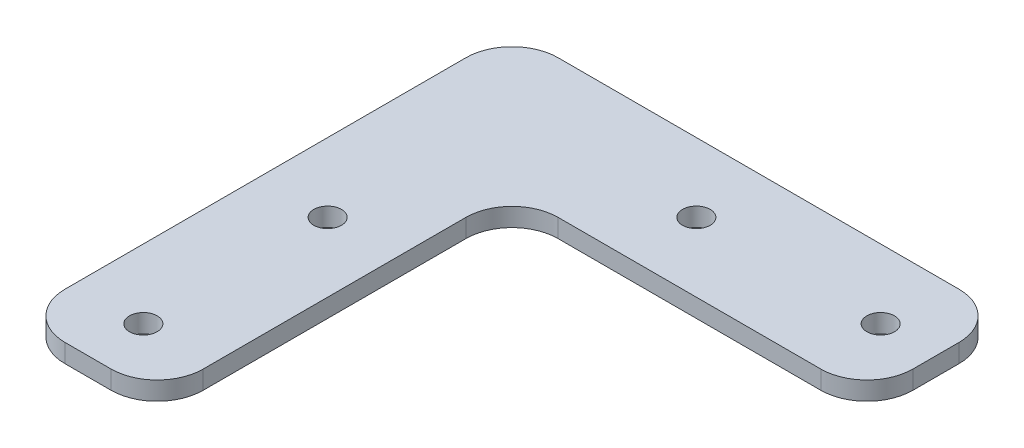
ISO-10303-21;
HEADER;
FILE_DESCRIPTION(('STEP AP214'),'2;1');
FILE_NAME('part.step','',(''),(''),'','','');
FILE_SCHEMA(('AUTOMOTIVE_DESIGN { 1 0 10303 214 1 1 1 1 }'));
ENDSEC;
DATA;
#1=APPLICATION_CONTEXT('core data for automotive mechanical design processes');
#2=APPLICATION_PROTOCOL_DEFINITION('international standard','automotive_design',2000,#1);
#3=PRODUCT_CONTEXT('',#1,'mechanical');
#4=PRODUCT('Part','Part','',(#3));
#5=PRODUCT_RELATED_PRODUCT_CATEGORY('part','',(#4));
#6=PRODUCT_DEFINITION_FORMATION('','',#4);
#7=PRODUCT_DEFINITION_CONTEXT('part definition',#1,'design');
#8=PRODUCT_DEFINITION('design','',#6,#7);
#9=PRODUCT_DEFINITION_SHAPE('','',#8);
#10=(LENGTH_UNIT() NAMED_UNIT(*) SI_UNIT(.MILLI.,.METRE.));
#11=(NAMED_UNIT(*) PLANE_ANGLE_UNIT() SI_UNIT($,.RADIAN.));
#12=(NAMED_UNIT(*) SI_UNIT($,.STERADIAN.) SOLID_ANGLE_UNIT());
#13=UNCERTAINTY_MEASURE_WITH_UNIT(LENGTH_MEASURE(1.E-05),#10,'distance_accuracy_value','');
#14=(GEOMETRIC_REPRESENTATION_CONTEXT(3) GLOBAL_UNCERTAINTY_ASSIGNED_CONTEXT((#13)) GLOBAL_UNIT_ASSIGNED_CONTEXT((#10,
#11,#12)) REPRESENTATION_CONTEXT('',''));
#15=CARTESIAN_POINT('',(0.,0.,0.));
#16=DIRECTION('',(0.,0.,1.));
#17=DIRECTION('',(1.,0.,0.));
#18=AXIS2_PLACEMENT_3D('',#15,#16,#17);
#19=CARTESIAN_POINT('',(0.,2.,0.));
#20=DIRECTION('',(0.,1.,0.));
#21=DIRECTION('',(0.,0.,1.));
#22=AXIS2_PLACEMENT_3D('',#19,#20,#21);
#23=PLANE('',#22);
#24=CARTESIAN_POINT('',(20.,2.,2.15105711021124E-13));
#25=DIRECTION('',(0.,1.,0.));
#26=DIRECTION('',(0.,0.,-1.));
#27=AXIS2_PLACEMENT_3D('',#24,#25,#26);
#28=CIRCLE('',#27,1.5);
#29=CARTESIAN_POINT('',(20.,2.,-1.49999999999979));
#30=VERTEX_POINT('',#29);
#31=EDGE_CURVE('E291',#30,#30,#28,.T.);
#32=ORIENTED_EDGE('',*,*,#31,.F.);
#33=EDGE_LOOP('',(#32));
#34=FACE_BOUND('',#33,.T.);
#35=CARTESIAN_POINT('',(0.,2.,40.));
#36=DIRECTION('',(0.,1.,0.));
#37=DIRECTION('',(0.,0.,1.));
#38=AXIS2_PLACEMENT_3D('',#35,#36,#37);
#39=CIRCLE('',#38,1.5);
#40=CARTESIAN_POINT('',(0.,2.,41.5));
#41=VERTEX_POINT('',#40);
#42=EDGE_CURVE('E277',#41,#41,#39,.T.);
#43=ORIENTED_EDGE('',*,*,#42,.F.);
#44=EDGE_LOOP('',(#43));
#45=FACE_BOUND('',#44,.T.);
#46=DIRECTION('',(1.,0.,0.));
#47=VECTOR('',#46,1.);
#48=CARTESIAN_POINT('',(7.5,2.,46.));
#49=LINE('',#48,#47);
#50=CARTESIAN_POINT('',(-2.5,2.,46.));
#51=VERTEX_POINT('',#50);
#52=CARTESIAN_POINT('',(2.5,2.,46.));
#53=VERTEX_POINT('',#52);
#54=EDGE_CURVE('E254',#51,#53,#49,.T.);
#55=ORIENTED_EDGE('',*,*,#54,.T.);
#56=CARTESIAN_POINT('',(2.5,2.,41.));
#57=DIRECTION('',(0.,1.,0.));
#58=DIRECTION('',(0.,0.,1.));
#59=AXIS2_PLACEMENT_3D('',#56,#57,#58);
#60=CIRCLE('',#59,5.);
#61=CARTESIAN_POINT('',(7.5,2.,41.));
#62=VERTEX_POINT('',#61);
#63=EDGE_CURVE('E211',#53,#62,#60,.T.);
#64=ORIENTED_EDGE('',*,*,#63,.T.);
#65=DIRECTION('',(0.,0.,-1.));
#66=VECTOR('',#65,1.);
#67=CARTESIAN_POINT('',(7.5,2.,7.50000000000008));
#68=LINE('',#67,#66);
#69=CARTESIAN_POINT('',(7.5,2.,12.5000000000001));
#70=VERTEX_POINT('',#69);
#71=EDGE_CURVE('E161',#62,#70,#68,.T.);
#72=ORIENTED_EDGE('',*,*,#71,.T.);
#73=CARTESIAN_POINT('',(12.5,2.,12.5000000000001));
#74=DIRECTION('',(0.,1.,0.));
#75=DIRECTION('',(0.,0.,1.));
#76=AXIS2_PLACEMENT_3D('',#73,#74,#75);
#77=CIRCLE('',#76,5.);
#78=CARTESIAN_POINT('',(12.5000000000001,2.,7.50000000000013));
#79=VERTEX_POINT('',#78);
#80=EDGE_CURVE('E11',#70,#79,#77,.F.);
#81=ORIENTED_EDGE('',*,*,#80,.T.);
#82=DIRECTION('',(1.,0.,0.));
#83=VECTOR('',#82,1.);
#84=CARTESIAN_POINT('',(7.5,2.,7.50000000000008));
#85=LINE('',#84,#83);
#86=CARTESIAN_POINT('',(40.9999999999999,2.,7.50000000000044));
#87=VERTEX_POINT('',#86);
#88=EDGE_CURVE('E170',#79,#87,#85,.T.);
#89=ORIENTED_EDGE('',*,*,#88,.T.);
#90=CARTESIAN_POINT('',(41.,2.,2.50000000000044));
#91=DIRECTION('',(0.,1.,0.));
#92=DIRECTION('',(0.,0.,1.));
#93=AXIS2_PLACEMENT_3D('',#90,#91,#92);
#94=CIRCLE('',#93,5.);
#95=CARTESIAN_POINT('',(46.,2.,2.5000000000005));
#96=VERTEX_POINT('',#95);
#97=EDGE_CURVE('E200',#87,#96,#94,.T.);
#98=ORIENTED_EDGE('',*,*,#97,.T.);
#99=DIRECTION('',(0.,0.,-1.));
#100=VECTOR('',#99,1.);
#101=CARTESIAN_POINT('',(45.9999999999999,2.,7.5000000000005));
#102=LINE('',#101,#100);
#103=CARTESIAN_POINT('',(46.,2.,-2.4999999999995));
#104=VERTEX_POINT('',#103);
#105=EDGE_CURVE('E177',#96,#104,#102,.T.);
#106=ORIENTED_EDGE('',*,*,#105,.T.);
#107=CARTESIAN_POINT('',(41.,2.,-2.49999999999955));
#108=DIRECTION('',(0.,1.,0.));
#109=DIRECTION('',(0.,0.,1.));
#110=AXIS2_PLACEMENT_3D('',#107,#108,#109);
#111=CIRCLE('',#110,5.);
#112=CARTESIAN_POINT('',(41.0000000000001,2.,-7.49999999999955));
#113=VERTEX_POINT('',#112);
#114=EDGE_CURVE('E203',#104,#113,#111,.T.);
#115=ORIENTED_EDGE('',*,*,#114,.T.);
#116=DIRECTION('',(-1.,0.,0.));
#117=VECTOR('',#116,1.);
#118=CARTESIAN_POINT('',(46.0000000000001,2.,-7.4999999999995));
#119=LINE('',#118,#117);
#120=CARTESIAN_POINT('',(-2.49999999999995,2.,-7.50000000000002));
#121=VERTEX_POINT('',#120);
#122=EDGE_CURVE('E264',#113,#121,#119,.T.);
#123=ORIENTED_EDGE('',*,*,#122,.T.);
#124=CARTESIAN_POINT('',(-2.5,2.,-2.50000000000002));
#125=DIRECTION('',(0.,1.,0.));
#126=DIRECTION('',(0.,0.,1.));
#127=AXIS2_PLACEMENT_3D('',#124,#125,#126);
#128=CIRCLE('',#127,5.);
#129=CARTESIAN_POINT('',(-7.5,2.,-2.50000000000002));
#130=VERTEX_POINT('',#129);
#131=EDGE_CURVE('E72',#121,#130,#128,.T.);
#132=ORIENTED_EDGE('',*,*,#131,.T.);
#133=DIRECTION('',(0.,0.,1.));
#134=VECTOR('',#133,1.);
#135=CARTESIAN_POINT('',(-7.5,2.,46.));
#136=LINE('',#135,#134);
#137=CARTESIAN_POINT('',(-7.5,2.,41.));
#138=VERTEX_POINT('',#137);
#139=EDGE_CURVE('E260',#130,#138,#136,.T.);
#140=ORIENTED_EDGE('',*,*,#139,.T.);
#141=CARTESIAN_POINT('',(-2.5,2.,41.));
#142=DIRECTION('',(0.,1.,0.));
#143=DIRECTION('',(0.,0.,1.));
#144=AXIS2_PLACEMENT_3D('',#141,#142,#143);
#145=CIRCLE('',#144,5.);
#146=EDGE_CURVE('E208',#138,#51,#145,.T.);
#147=ORIENTED_EDGE('',*,*,#146,.T.);
#148=EDGE_LOOP('',(#55,#64,#72,#81,#89,#98,#106,#115,#123,#132,#140,#147));
#149=FACE_BOUND('',#148,.T.);
#150=CARTESIAN_POINT('',(0.,2.,20.));
#151=DIRECTION('',(0.,1.,0.));
#152=DIRECTION('',(0.,0.,1.));
#153=AXIS2_PLACEMENT_3D('',#150,#151,#152);
#154=CIRCLE('',#153,1.5);
#155=CARTESIAN_POINT('',(0.,2.,21.5));
#156=VERTEX_POINT('',#155);
#157=EDGE_CURVE('E317',#156,#156,#154,.T.);
#158=ORIENTED_EDGE('',*,*,#157,.F.);
#159=EDGE_LOOP('',(#158));
#160=FACE_BOUND('',#159,.T.);
#161=CARTESIAN_POINT('',(40.,2.,4.37150315946155E-13));
#162=DIRECTION('',(0.,1.,0.));
#163=DIRECTION('',(0.,0.,-1.));
#164=AXIS2_PLACEMENT_3D('',#161,#162,#163);
#165=CIRCLE('',#164,1.5);
#166=CARTESIAN_POINT('',(40.,2.,-1.49999999999957));
#167=VERTEX_POINT('',#166);
#168=EDGE_CURVE('E292',#167,#167,#165,.T.);
#169=ORIENTED_EDGE('',*,*,#168,.F.);
#170=EDGE_LOOP('',(#169));
#171=FACE_BOUND('',#170,.T.);
#172=ADVANCED_FACE('F49',(#34,#45,#149,#160,#171),#23,.T.);
#173=CARTESIAN_POINT('',(0.,0.,0.));
#174=DIRECTION('',(0.,1.,0.));
#175=DIRECTION('',(0.,0.,1.));
#176=AXIS2_PLACEMENT_3D('',#173,#174,#175);
#177=PLANE('',#176);
#178=DIRECTION('',(0.,0.,-1.));
#179=VECTOR('',#178,1.);
#180=CARTESIAN_POINT('',(7.5,0.,7.50000000000008));
#181=LINE('',#180,#179);
#182=CARTESIAN_POINT('',(7.5,0.,41.));
#183=VERTEX_POINT('',#182);
#184=CARTESIAN_POINT('',(7.5,0.,12.5000000000001));
#185=VERTEX_POINT('',#184);
#186=EDGE_CURVE('E158',#183,#185,#181,.T.);
#187=ORIENTED_EDGE('',*,*,#186,.F.);
#188=CARTESIAN_POINT('',(2.5,0.,41.));
#189=DIRECTION('',(0.,1.,0.));
#190=DIRECTION('',(0.,0.,1.));
#191=AXIS2_PLACEMENT_3D('',#188,#189,#190);
#192=CIRCLE('',#191,5.);
#193=CARTESIAN_POINT('',(2.5,0.,46.));
#194=VERTEX_POINT('',#193);
#195=EDGE_CURVE('E140',#183,#194,#192,.F.);
#196=ORIENTED_EDGE('',*,*,#195,.T.);
#197=DIRECTION('',(1.,0.,0.));
#198=VECTOR('',#197,1.);
#199=CARTESIAN_POINT('',(7.5,0.,46.));
#200=LINE('',#199,#198);
#201=CARTESIAN_POINT('',(-2.5,0.,46.));
#202=VERTEX_POINT('',#201);
#203=EDGE_CURVE('E171',#202,#194,#200,.T.);
#204=ORIENTED_EDGE('',*,*,#203,.F.);
#205=CARTESIAN_POINT('',(-2.5,0.,41.));
#206=DIRECTION('',(0.,1.,0.));
#207=DIRECTION('',(0.,0.,1.));
#208=AXIS2_PLACEMENT_3D('',#205,#206,#207);
#209=CIRCLE('',#208,5.);
#210=CARTESIAN_POINT('',(-7.5,0.,41.));
#211=VERTEX_POINT('',#210);
#212=EDGE_CURVE('E152',#202,#211,#209,.F.);
#213=ORIENTED_EDGE('',*,*,#212,.T.);
#214=DIRECTION('',(0.,0.,1.));
#215=VECTOR('',#214,1.);
#216=CARTESIAN_POINT('',(-7.5,0.,46.));
#217=LINE('',#216,#215);
#218=CARTESIAN_POINT('',(-7.5,0.,-2.50000000000002));
#219=VERTEX_POINT('',#218);
#220=EDGE_CURVE('E179',#219,#211,#217,.T.);
#221=ORIENTED_EDGE('',*,*,#220,.F.);
#222=CARTESIAN_POINT('',(-2.5,0.,-2.50000000000002));
#223=DIRECTION('',(0.,1.,0.));
#224=DIRECTION('',(0.,0.,1.));
#225=AXIS2_PLACEMENT_3D('',#222,#223,#224);
#226=CIRCLE('',#225,5.);
#227=CARTESIAN_POINT('',(-2.49999999999995,0.,-7.50000000000002));
#228=VERTEX_POINT('',#227);
#229=EDGE_CURVE('E190',#219,#228,#226,.F.);
#230=ORIENTED_EDGE('',*,*,#229,.T.);
#231=DIRECTION('',(-1.,0.,0.));
#232=VECTOR('',#231,1.);
#233=CARTESIAN_POINT('',(46.0000000000001,0.,-7.4999999999995));
#234=LINE('',#233,#232);
#235=CARTESIAN_POINT('',(41.0000000000001,0.,-7.49999999999955));
#236=VERTEX_POINT('',#235);
#237=EDGE_CURVE('E448',#236,#228,#234,.T.);
#238=ORIENTED_EDGE('',*,*,#237,.F.);
#239=CARTESIAN_POINT('',(41.,0.,-2.49999999999955));
#240=DIRECTION('',(0.,1.,0.));
#241=DIRECTION('',(0.,0.,1.));
#242=AXIS2_PLACEMENT_3D('',#239,#240,#241);
#243=CIRCLE('',#242,5.);
#244=CARTESIAN_POINT('',(46.,0.,-2.4999999999995));
#245=VERTEX_POINT('',#244);
#246=EDGE_CURVE('E187',#236,#245,#243,.F.);
#247=ORIENTED_EDGE('',*,*,#246,.T.);
#248=DIRECTION('',(0.,0.,-1.));
#249=VECTOR('',#248,1.);
#250=CARTESIAN_POINT('',(45.9999999999999,0.,7.5000000000005));
#251=LINE('',#250,#249);
#252=CARTESIAN_POINT('',(46.,0.,2.5000000000005));
#253=VERTEX_POINT('',#252);
#254=EDGE_CURVE('E452',#253,#245,#251,.T.);
#255=ORIENTED_EDGE('',*,*,#254,.F.);
#256=CARTESIAN_POINT('',(41.,0.,2.50000000000044));
#257=DIRECTION('',(0.,1.,0.));
#258=DIRECTION('',(0.,0.,1.));
#259=AXIS2_PLACEMENT_3D('',#256,#257,#258);
#260=CIRCLE('',#259,5.);
#261=CARTESIAN_POINT('',(40.9999999999999,0.,7.50000000000044));
#262=VERTEX_POINT('',#261);
#263=EDGE_CURVE('E163',#253,#262,#260,.F.);
#264=ORIENTED_EDGE('',*,*,#263,.T.);
#265=DIRECTION('',(1.,0.,0.));
#266=VECTOR('',#265,1.);
#267=CARTESIAN_POINT('',(7.5,0.,7.50000000000008));
#268=LINE('',#267,#266);
#269=CARTESIAN_POINT('',(12.5000000000001,0.,7.50000000000013));
#270=VERTEX_POINT('',#269);
#271=EDGE_CURVE('E282',#270,#262,#268,.T.);
#272=ORIENTED_EDGE('',*,*,#271,.F.);
#273=CARTESIAN_POINT('',(12.5,0.,12.5000000000001));
#274=DIRECTION('',(0.,1.,0.));
#275=DIRECTION('',(0.,0.,1.));
#276=AXIS2_PLACEMENT_3D('',#273,#274,#275);
#277=CIRCLE('',#276,5.);
#278=EDGE_CURVE('E58',#270,#185,#277,.T.);
#279=ORIENTED_EDGE('',*,*,#278,.T.);
#280=EDGE_LOOP('',(#187,#196,#204,#213,#221,#230,#238,#247,#255,#264,#272,#279));
#281=FACE_BOUND('',#280,.T.);
#282=CARTESIAN_POINT('',(0.,0.,40.));
#283=DIRECTION('',(0.,1.,0.));
#284=DIRECTION('',(0.,0.,1.));
#285=AXIS2_PLACEMENT_3D('',#282,#283,#284);
#286=CIRCLE('',#285,1.5);
#287=CARTESIAN_POINT('',(0.,0.,41.5));
#288=VERTEX_POINT('',#287);
#289=EDGE_CURVE('E283',#288,#288,#286,.T.);
#290=ORIENTED_EDGE('',*,*,#289,.T.);
#291=EDGE_LOOP('',(#290));
#292=FACE_BOUND('',#291,.T.);
#293=CARTESIAN_POINT('',(0.,0.,20.));
#294=DIRECTION('',(0.,1.,0.));
#295=DIRECTION('',(0.,0.,1.));
#296=AXIS2_PLACEMENT_3D('',#293,#294,#295);
#297=CIRCLE('',#296,1.5);
#298=CARTESIAN_POINT('',(0.,0.,21.5));
#299=VERTEX_POINT('',#298);
#300=EDGE_CURVE('E311',#299,#299,#297,.T.);
#301=ORIENTED_EDGE('',*,*,#300,.T.);
#302=EDGE_LOOP('',(#301));
#303=FACE_BOUND('',#302,.T.);
#304=CARTESIAN_POINT('',(20.,0.,2.15105711021124E-13));
#305=DIRECTION('',(0.,1.,0.));
#306=DIRECTION('',(0.,0.,-1.));
#307=AXIS2_PLACEMENT_3D('',#304,#305,#306);
#308=CIRCLE('',#307,1.5);
#309=CARTESIAN_POINT('',(20.,0.,-1.49999999999979));
#310=VERTEX_POINT('',#309);
#311=EDGE_CURVE('E287',#310,#310,#308,.T.);
#312=ORIENTED_EDGE('',*,*,#311,.T.);
#313=EDGE_LOOP('',(#312));
#314=FACE_BOUND('',#313,.T.);
#315=CARTESIAN_POINT('',(40.,0.,4.37150315946155E-13));
#316=DIRECTION('',(0.,1.,0.));
#317=DIRECTION('',(0.,0.,-1.));
#318=AXIS2_PLACEMENT_3D('',#315,#316,#317);
#319=CIRCLE('',#318,1.5);
#320=CARTESIAN_POINT('',(40.,0.,-1.49999999999957));
#321=VERTEX_POINT('',#320);
#322=EDGE_CURVE('E297',#321,#321,#319,.T.);
#323=ORIENTED_EDGE('',*,*,#322,.T.);
#324=EDGE_LOOP('',(#323));
#325=FACE_BOUND('',#324,.T.);
#326=ADVANCED_FACE('F166',(#281,#292,#303,#314,#325),#177,.F.);
#327=CARTESIAN_POINT('',(7.5,2.,7.50000000000008));
#328=DIRECTION('',(0.,0.,-1.));
#329=DIRECTION('',(-1.,0.,0.));
#330=AXIS2_PLACEMENT_3D('',#327,#328,#329);
#331=PLANE('',#330);
#332=ORIENTED_EDGE('',*,*,#271,.T.);
#333=DIRECTION('',(0.,-1.,0.));
#334=VECTOR('',#333,1.);
#335=CARTESIAN_POINT('',(40.9999999999999,2.,7.50000000000044));
#336=LINE('',#335,#334);
#337=EDGE_CURVE('E238',#262,#87,#336,.F.);
#338=ORIENTED_EDGE('',*,*,#337,.T.);
#339=ORIENTED_EDGE('',*,*,#88,.F.);
#340=DIRECTION('',(0.,-1.,0.));
#341=VECTOR('',#340,1.);
#342=CARTESIAN_POINT('',(12.5000000000001,0.,7.50000000000013));
#343=LINE('',#342,#341);
#344=EDGE_CURVE('E234',#79,#270,#343,.T.);
#345=ORIENTED_EDGE('',*,*,#344,.T.);
#346=EDGE_LOOP('',(#332,#338,#339,#345));
#347=FACE_BOUND('',#346,.T.);
#348=ADVANCED_FACE('F378',(#347),#331,.F.);
#349=CARTESIAN_POINT('',(45.9999999999999,2.,7.5000000000005));
#350=DIRECTION('',(-1.,0.,0.));
#351=DIRECTION('',(0.,0.,1.));
#352=AXIS2_PLACEMENT_3D('',#349,#350,#351);
#353=PLANE('',#352);
#354=ORIENTED_EDGE('',*,*,#254,.T.);
#355=DIRECTION('',(0.,-1.,0.));
#356=VECTOR('',#355,1.);
#357=CARTESIAN_POINT('',(46.,2.,-2.4999999999995));
#358=LINE('',#357,#356);
#359=EDGE_CURVE('E231',#245,#104,#358,.F.);
#360=ORIENTED_EDGE('',*,*,#359,.T.);
#361=ORIENTED_EDGE('',*,*,#105,.F.);
#362=DIRECTION('',(0.,-1.,0.));
#363=VECTOR('',#362,1.);
#364=CARTESIAN_POINT('',(46.,2.,2.5000000000005));
#365=LINE('',#364,#363);
#366=EDGE_CURVE('E227',#96,#253,#365,.T.);
#367=ORIENTED_EDGE('',*,*,#366,.T.);
#368=EDGE_LOOP('',(#354,#360,#361,#367));
#369=FACE_BOUND('',#368,.T.);
#370=ADVANCED_FACE('F381',(#369),#353,.F.);
#371=CARTESIAN_POINT('',(46.0000000000001,2.,-7.4999999999995));
#372=DIRECTION('',(0.,0.,1.));
#373=DIRECTION('',(1.,0.,0.));
#374=AXIS2_PLACEMENT_3D('',#371,#372,#373);
#375=PLANE('',#374);
#376=ORIENTED_EDGE('',*,*,#237,.T.);
#377=DIRECTION('',(0.,-1.,0.));
#378=VECTOR('',#377,1.);
#379=CARTESIAN_POINT('',(-2.49999999999995,2.,-7.50000000000002));
#380=LINE('',#379,#378);
#381=EDGE_CURVE('E224',#228,#121,#380,.F.);
#382=ORIENTED_EDGE('',*,*,#381,.T.);
#383=ORIENTED_EDGE('',*,*,#122,.F.);
#384=DIRECTION('',(0.,-1.,0.));
#385=VECTOR('',#384,1.);
#386=CARTESIAN_POINT('',(41.0000000000001,2.,-7.49999999999955));
#387=LINE('',#386,#385);
#388=EDGE_CURVE('E220',#113,#236,#387,.T.);
#389=ORIENTED_EDGE('',*,*,#388,.T.);
#390=EDGE_LOOP('',(#376,#382,#383,#389));
#391=FACE_BOUND('',#390,.T.);
#392=ADVANCED_FACE('F334',(#391),#375,.F.);
#393=CARTESIAN_POINT('',(-7.5,2.,46.));
#394=DIRECTION('',(1.,0.,0.));
#395=DIRECTION('',(0.,0.,-1.));
#396=AXIS2_PLACEMENT_3D('',#393,#394,#395);
#397=PLANE('',#396);
#398=ORIENTED_EDGE('',*,*,#220,.T.);
#399=DIRECTION('',(0.,-1.,0.));
#400=VECTOR('',#399,1.);
#401=CARTESIAN_POINT('',(-7.5,2.,41.));
#402=LINE('',#401,#400);
#403=EDGE_CURVE('E65',#211,#138,#402,.F.);
#404=ORIENTED_EDGE('',*,*,#403,.T.);
#405=ORIENTED_EDGE('',*,*,#139,.F.);
#406=DIRECTION('',(0.,-1.,0.));
#407=VECTOR('',#406,1.);
#408=CARTESIAN_POINT('',(-7.5,2.,-2.50000000000002));
#409=LINE('',#408,#407);
#410=EDGE_CURVE('E214',#130,#219,#409,.T.);
#411=ORIENTED_EDGE('',*,*,#410,.T.);
#412=EDGE_LOOP('',(#398,#404,#405,#411));
#413=FACE_BOUND('',#412,.T.);
#414=ADVANCED_FACE('F329',(#413),#397,.F.);
#415=CARTESIAN_POINT('',(7.5,2.,46.));
#416=DIRECTION('',(0.,0.,-1.));
#417=DIRECTION('',(-1.,0.,0.));
#418=AXIS2_PLACEMENT_3D('',#415,#416,#417);
#419=PLANE('',#418);
#420=ORIENTED_EDGE('',*,*,#203,.T.);
#421=DIRECTION('',(0.,-1.,0.));
#422=VECTOR('',#421,1.);
#423=CARTESIAN_POINT('',(2.5,2.,46.));
#424=LINE('',#423,#422);
#425=EDGE_CURVE('E145',#194,#53,#424,.F.);
#426=ORIENTED_EDGE('',*,*,#425,.T.);
#427=ORIENTED_EDGE('',*,*,#54,.F.);
#428=DIRECTION('',(0.,-1.,0.));
#429=VECTOR('',#428,1.);
#430=CARTESIAN_POINT('',(-2.5,2.,46.));
#431=LINE('',#430,#429);
#432=EDGE_CURVE('E151',#51,#202,#431,.T.);
#433=ORIENTED_EDGE('',*,*,#432,.T.);
#434=EDGE_LOOP('',(#420,#426,#427,#433));
#435=FACE_BOUND('',#434,.T.);
#436=ADVANCED_FACE('F333',(#435),#419,.F.);
#437=CARTESIAN_POINT('',(7.5,2.,7.50000000000008));
#438=DIRECTION('',(-1.,0.,0.));
#439=DIRECTION('',(0.,0.,1.));
#440=AXIS2_PLACEMENT_3D('',#437,#438,#439);
#441=PLANE('',#440);
#442=ORIENTED_EDGE('',*,*,#71,.F.);
#443=DIRECTION('',(0.,-1.,0.));
#444=VECTOR('',#443,1.);
#445=CARTESIAN_POINT('',(7.5,2.,41.));
#446=LINE('',#445,#444);
#447=EDGE_CURVE('E144',#62,#183,#446,.T.);
#448=ORIENTED_EDGE('',*,*,#447,.T.);
#449=ORIENTED_EDGE('',*,*,#186,.T.);
#450=DIRECTION('',(0.,-1.,0.));
#451=VECTOR('',#450,1.);
#452=CARTESIAN_POINT('',(7.5,2.,12.5000000000001));
#453=LINE('',#452,#451);
#454=EDGE_CURVE('E164',#185,#70,#453,.F.);
#455=ORIENTED_EDGE('',*,*,#454,.T.);
#456=EDGE_LOOP('',(#442,#448,#449,#455));
#457=FACE_BOUND('',#456,.T.);
#458=ADVANCED_FACE('F157',(#457),#441,.F.);
#459=CARTESIAN_POINT('',(0.,2.,40.));
#460=DIRECTION('',(0.,-1.,0.));
#461=DIRECTION('',(0.,0.,-1.));
#462=AXIS2_PLACEMENT_3D('',#459,#460,#461);
#463=CYLINDRICAL_SURFACE('',#462,1.5);
#464=ORIENTED_EDGE('',*,*,#42,.T.);
#465=EDGE_LOOP('',(#464));
#466=FACE_BOUND('',#465,.T.);
#467=ORIENTED_EDGE('',*,*,#289,.F.);
#468=EDGE_LOOP('',(#467));
#469=FACE_BOUND('',#468,.T.);
#470=ADVANCED_FACE('F366',(#466,#469),#463,.F.);
#471=CARTESIAN_POINT('',(0.,2.,20.));
#472=DIRECTION('',(0.,-1.,0.));
#473=DIRECTION('',(0.,0.,-1.));
#474=AXIS2_PLACEMENT_3D('',#471,#472,#473);
#475=CYLINDRICAL_SURFACE('',#474,1.5);
#476=ORIENTED_EDGE('',*,*,#157,.T.);
#477=EDGE_LOOP('',(#476));
#478=FACE_BOUND('',#477,.T.);
#479=ORIENTED_EDGE('',*,*,#300,.F.);
#480=EDGE_LOOP('',(#479));
#481=FACE_BOUND('',#480,.T.);
#482=ADVANCED_FACE('F426',(#478,#481),#475,.F.);
#483=CARTESIAN_POINT('',(20.,2.,2.15105711021124E-13));
#484=DIRECTION('',(0.,-1.,0.));
#485=DIRECTION('',(0.,0.,-1.));
#486=AXIS2_PLACEMENT_3D('',#483,#484,#485);
#487=CYLINDRICAL_SURFACE('',#486,1.5);
#488=ORIENTED_EDGE('',*,*,#31,.T.);
#489=EDGE_LOOP('',(#488));
#490=FACE_BOUND('',#489,.T.);
#491=ORIENTED_EDGE('',*,*,#311,.F.);
#492=EDGE_LOOP('',(#491));
#493=FACE_BOUND('',#492,.T.);
#494=ADVANCED_FACE('F422',(#490,#493),#487,.F.);
#495=CARTESIAN_POINT('',(40.,2.,4.37150315946155E-13));
#496=DIRECTION('',(0.,-1.,0.));
#497=DIRECTION('',(0.,0.,-1.));
#498=AXIS2_PLACEMENT_3D('',#495,#496,#497);
#499=CYLINDRICAL_SURFACE('',#498,1.5);
#500=ORIENTED_EDGE('',*,*,#168,.T.);
#501=EDGE_LOOP('',(#500));
#502=FACE_BOUND('',#501,.T.);
#503=ORIENTED_EDGE('',*,*,#322,.F.);
#504=EDGE_LOOP('',(#503));
#505=FACE_BOUND('',#504,.T.);
#506=ADVANCED_FACE('F360',(#502,#505),#499,.F.);
#507=CARTESIAN_POINT('',(2.5,2.,41.));
#508=DIRECTION('',(0.,-1.,0.));
#509=DIRECTION('',(0.,0.,-1.));
#510=AXIS2_PLACEMENT_3D('',#507,#508,#509);
#511=CYLINDRICAL_SURFACE('',#510,5.);
#512=ORIENTED_EDGE('',*,*,#63,.F.);
#513=ORIENTED_EDGE('',*,*,#425,.F.);
#514=ORIENTED_EDGE('',*,*,#195,.F.);
#515=ORIENTED_EDGE('',*,*,#447,.F.);
#516=EDGE_LOOP('',(#512,#513,#514,#515));
#517=FACE_BOUND('',#516,.T.);
#518=ADVANCED_FACE('F143',(#517),#511,.T.);
#519=CARTESIAN_POINT('',(-2.5,2.,41.));
#520=DIRECTION('',(0.,-1.,0.));
#521=DIRECTION('',(0.,0.,-1.));
#522=AXIS2_PLACEMENT_3D('',#519,#520,#521);
#523=CYLINDRICAL_SURFACE('',#522,5.);
#524=ORIENTED_EDGE('',*,*,#146,.F.);
#525=ORIENTED_EDGE('',*,*,#403,.F.);
#526=ORIENTED_EDGE('',*,*,#212,.F.);
#527=ORIENTED_EDGE('',*,*,#432,.F.);
#528=EDGE_LOOP('',(#524,#525,#526,#527));
#529=FACE_BOUND('',#528,.T.);
#530=ADVANCED_FACE('F340',(#529),#523,.T.);
#531=CARTESIAN_POINT('',(-2.5,2.,-2.50000000000002));
#532=DIRECTION('',(0.,-1.,0.));
#533=DIRECTION('',(0.,0.,-1.));
#534=AXIS2_PLACEMENT_3D('',#531,#532,#533);
#535=CYLINDRICAL_SURFACE('',#534,5.);
#536=ORIENTED_EDGE('',*,*,#131,.F.);
#537=ORIENTED_EDGE('',*,*,#381,.F.);
#538=ORIENTED_EDGE('',*,*,#229,.F.);
#539=ORIENTED_EDGE('',*,*,#410,.F.);
#540=EDGE_LOOP('',(#536,#537,#538,#539));
#541=FACE_BOUND('',#540,.T.);
#542=ADVANCED_FACE('F344',(#541),#535,.T.);
#543=CARTESIAN_POINT('',(41.,2.,-2.49999999999955));
#544=DIRECTION('',(0.,-1.,0.));
#545=DIRECTION('',(0.,0.,-1.));
#546=AXIS2_PLACEMENT_3D('',#543,#544,#545);
#547=CYLINDRICAL_SURFACE('',#546,5.);
#548=ORIENTED_EDGE('',*,*,#114,.F.);
#549=ORIENTED_EDGE('',*,*,#359,.F.);
#550=ORIENTED_EDGE('',*,*,#246,.F.);
#551=ORIENTED_EDGE('',*,*,#388,.F.);
#552=EDGE_LOOP('',(#548,#549,#550,#551));
#553=FACE_BOUND('',#552,.T.);
#554=ADVANCED_FACE('F388',(#553),#547,.T.);
#555=CARTESIAN_POINT('',(41.,2.,2.50000000000044));
#556=DIRECTION('',(0.,-1.,0.));
#557=DIRECTION('',(0.,0.,-1.));
#558=AXIS2_PLACEMENT_3D('',#555,#556,#557);
#559=CYLINDRICAL_SURFACE('',#558,5.);
#560=ORIENTED_EDGE('',*,*,#97,.F.);
#561=ORIENTED_EDGE('',*,*,#337,.F.);
#562=ORIENTED_EDGE('',*,*,#263,.F.);
#563=ORIENTED_EDGE('',*,*,#366,.F.);
#564=EDGE_LOOP('',(#560,#561,#562,#563));
#565=FACE_BOUND('',#564,.T.);
#566=ADVANCED_FACE('F373',(#565),#559,.T.);
#567=CARTESIAN_POINT('',(12.5,2.,12.5000000000001));
#568=DIRECTION('',(0.,1.,0.));
#569=DIRECTION('',(0.,0.,1.));
#570=AXIS2_PLACEMENT_3D('',#567,#568,#569);
#571=CYLINDRICAL_SURFACE('',#570,5.);
#572=ORIENTED_EDGE('',*,*,#80,.F.);
#573=ORIENTED_EDGE('',*,*,#454,.F.);
#574=ORIENTED_EDGE('',*,*,#278,.F.);
#575=ORIENTED_EDGE('',*,*,#344,.F.);
#576=EDGE_LOOP('',(#572,#573,#574,#575));
#577=FACE_BOUND('',#576,.T.);
#578=ADVANCED_FACE('F51',(#577),#571,.F.);
#579=CLOSED_SHELL('',(#172,#326,#348,#370,#392,#414,#436,#458,#470,#482,#494,#506,#518,#530,
#542,#554,#566,#578));
#580=MANIFOLD_SOLID_BREP('B2',#579);
#581=ADVANCED_BREP_SHAPE_REPRESENTATION('',(#18,#580),#14);
#582=SHAPE_DEFINITION_REPRESENTATION(#9,#581);
ENDSEC;
END-ISO-10303-21;
